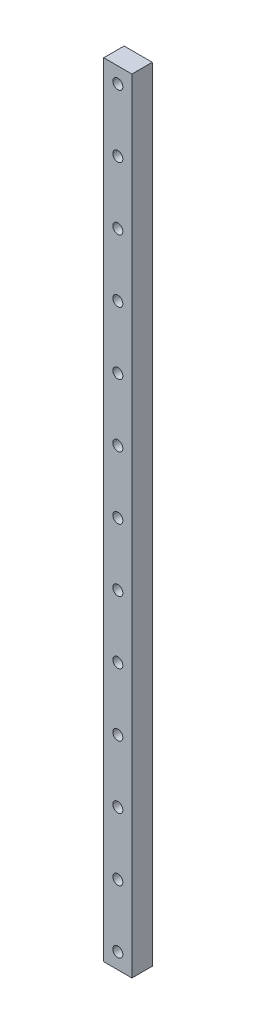
ISO-10303-21;
HEADER;
FILE_DESCRIPTION(('STEP AP214'),'2;1');
FILE_NAME('part.step','',(''),(''),'','','');
FILE_SCHEMA(('AUTOMOTIVE_DESIGN { 1 0 10303 214 1 1 1 1 }'));
ENDSEC;
DATA;
#1=APPLICATION_CONTEXT('core data for automotive mechanical design processes');
#2=APPLICATION_PROTOCOL_DEFINITION('international standard','automotive_design',2000,#1);
#3=PRODUCT_CONTEXT('',#1,'mechanical');
#4=PRODUCT('Part','Part','',(#3));
#5=PRODUCT_RELATED_PRODUCT_CATEGORY('part','',(#4));
#6=PRODUCT_DEFINITION_FORMATION('','',#4);
#7=PRODUCT_DEFINITION_CONTEXT('part definition',#1,'design');
#8=PRODUCT_DEFINITION('design','',#6,#7);
#9=PRODUCT_DEFINITION_SHAPE('','',#8);
#10=(LENGTH_UNIT() NAMED_UNIT(*) SI_UNIT(.MILLI.,.METRE.));
#11=(NAMED_UNIT(*) PLANE_ANGLE_UNIT() SI_UNIT($,.RADIAN.));
#12=(NAMED_UNIT(*) SI_UNIT($,.STERADIAN.) SOLID_ANGLE_UNIT());
#13=UNCERTAINTY_MEASURE_WITH_UNIT(LENGTH_MEASURE(1.E-05),#10,'distance_accuracy_value','');
#14=(GEOMETRIC_REPRESENTATION_CONTEXT(3) GLOBAL_UNCERTAINTY_ASSIGNED_CONTEXT((#13)) GLOBAL_UNIT_ASSIGNED_CONTEXT((#10,
#11,#12)) REPRESENTATION_CONTEXT('',''));
#15=CARTESIAN_POINT('',(0.,0.,0.));
#16=DIRECTION('',(0.,0.,1.));
#17=DIRECTION('',(1.,0.,0.));
#18=AXIS2_PLACEMENT_3D('',#15,#16,#17);
#19=CARTESIAN_POINT('',(0.,25.,-276.75));
#20=DIRECTION('',(0.,0.,1.));
#21=DIRECTION('',(1.,0.,0.));
#22=AXIS2_PLACEMENT_3D('',#19,#20,#21);
#23=CYLINDRICAL_SURFACE('',#22,1.6);
#24=DIRECTION('',(0.,0.,1.));
#25=VECTOR('',#24,1.);
#26=CARTESIAN_POINT('',(-1.6,25.,-276.75));
#27=LINE('',#26,#25);
#28=CARTESIAN_POINT('',(-1.6,25.,-3.25));
#29=VERTEX_POINT('',#28);
#30=CARTESIAN_POINT('',(-1.6,25.,3.25));
#31=VERTEX_POINT('',#30);
#32=EDGE_CURVE('E335',#29,#31,#27,.T.);
#33=ORIENTED_EDGE('',*,*,#32,.F.);
#34=CARTESIAN_POINT('',(0.,25.,-3.25));
#35=DIRECTION('',(0.,0.,1.));
#36=DIRECTION('',(1.,0.,0.));
#37=AXIS2_PLACEMENT_3D('',#34,#35,#36);
#38=CIRCLE('',#37,1.6);
#39=CARTESIAN_POINT('',(1.6,25.,-3.25));
#40=VERTEX_POINT('',#39);
#41=EDGE_CURVE('E385',#40,#29,#38,.T.);
#42=ORIENTED_EDGE('',*,*,#41,.F.);
#43=DIRECTION('',(0.,0.,1.));
#44=VECTOR('',#43,1.);
#45=CARTESIAN_POINT('',(1.6,25.,-276.75));
#46=LINE('',#45,#44);
#47=CARTESIAN_POINT('',(1.6,25.,3.25));
#48=VERTEX_POINT('',#47);
#49=EDGE_CURVE('E434',#40,#48,#46,.T.);
#50=ORIENTED_EDGE('',*,*,#49,.T.);
#51=CARTESIAN_POINT('',(0.,25.,3.25));
#52=DIRECTION('',(0.,0.,1.));
#53=DIRECTION('',(1.,0.,0.));
#54=AXIS2_PLACEMENT_3D('',#51,#52,#53);
#55=CIRCLE('',#54,1.6);
#56=EDGE_CURVE('E27',#48,#31,#55,.T.);
#57=ORIENTED_EDGE('',*,*,#56,.T.);
#58=EDGE_LOOP('',(#33,#42,#50,#57));
#59=FACE_BOUND('',#58,.T.);
#60=ADVANCED_FACE('F16',(#59),#23,.F.);
#61=CARTESIAN_POINT('',(0.,5.,-276.75));
#62=DIRECTION('',(0.,0.,1.));
#63=DIRECTION('',(1.,0.,0.));
#64=AXIS2_PLACEMENT_3D('',#61,#62,#63);
#65=CYLINDRICAL_SURFACE('',#64,1.6);
#66=DIRECTION('',(0.,0.,1.));
#67=VECTOR('',#66,1.);
#68=CARTESIAN_POINT('',(-1.6,5.,-276.75));
#69=LINE('',#68,#67);
#70=CARTESIAN_POINT('',(-1.6,5.,-3.25));
#71=VERTEX_POINT('',#70);
#72=CARTESIAN_POINT('',(-1.6,5.,3.25));
#73=VERTEX_POINT('',#72);
#74=EDGE_CURVE('E305',#71,#73,#69,.T.);
#75=ORIENTED_EDGE('',*,*,#74,.F.);
#76=CARTESIAN_POINT('',(0.,5.,-3.25));
#77=DIRECTION('',(0.,0.,1.));
#78=DIRECTION('',(1.,0.,0.));
#79=AXIS2_PLACEMENT_3D('',#76,#77,#78);
#80=CIRCLE('',#79,1.6);
#81=CARTESIAN_POINT('',(1.6,5.,-3.25));
#82=VERTEX_POINT('',#81);
#83=EDGE_CURVE('E277',#82,#71,#80,.T.);
#84=ORIENTED_EDGE('',*,*,#83,.F.);
#85=DIRECTION('',(0.,0.,1.));
#86=VECTOR('',#85,1.);
#87=CARTESIAN_POINT('',(1.6,5.,-276.75));
#88=LINE('',#87,#86);
#89=CARTESIAN_POINT('',(1.6,5.,3.25));
#90=VERTEX_POINT('',#89);
#91=EDGE_CURVE('E421',#82,#90,#88,.T.);
#92=ORIENTED_EDGE('',*,*,#91,.T.);
#93=CARTESIAN_POINT('',(0.,5.,3.25));
#94=DIRECTION('',(0.,0.,1.));
#95=DIRECTION('',(1.,0.,0.));
#96=AXIS2_PLACEMENT_3D('',#93,#94,#95);
#97=CIRCLE('',#96,1.6);
#98=EDGE_CURVE('E10',#90,#73,#97,.T.);
#99=ORIENTED_EDGE('',*,*,#98,.T.);
#100=EDGE_LOOP('',(#75,#84,#92,#99));
#101=FACE_BOUND('',#100,.T.);
#102=ADVANCED_FACE('F1002',(#101),#65,.F.);
#103=CARTESIAN_POINT('',(0.,0.,0.));
#104=DIRECTION('',(0.,-1.,0.));
#105=DIRECTION('',(0.,0.,-1.));
#106=AXIS2_PLACEMENT_3D('',#103,#104,#105);
#107=PLANE('',#106);
#108=DIRECTION('',(0.,0.,-1.));
#109=VECTOR('',#108,1.);
#110=CARTESIAN_POINT('',(4.5,0.,3.25));
#111=LINE('',#110,#109);
#112=CARTESIAN_POINT('',(4.5,0.,3.25));
#113=VERTEX_POINT('',#112);
#114=CARTESIAN_POINT('',(4.5,0.,-3.25));
#115=VERTEX_POINT('',#114);
#116=EDGE_CURVE('E263',#113,#115,#111,.T.);
#117=ORIENTED_EDGE('',*,*,#116,.F.);
#118=DIRECTION('',(1.,0.,0.));
#119=VECTOR('',#118,1.);
#120=CARTESIAN_POINT('',(-4.5,0.,3.25));
#121=LINE('',#120,#119);
#122=CARTESIAN_POINT('',(-4.5,0.,3.25));
#123=VERTEX_POINT('',#122);
#124=EDGE_CURVE('E399',#123,#113,#121,.T.);
#125=ORIENTED_EDGE('',*,*,#124,.F.);
#126=DIRECTION('',(0.,0.,1.));
#127=VECTOR('',#126,1.);
#128=CARTESIAN_POINT('',(-4.5,0.,3.25));
#129=LINE('',#128,#127);
#130=CARTESIAN_POINT('',(-4.5,0.,-3.25));
#131=VERTEX_POINT('',#130);
#132=EDGE_CURVE('E272',#131,#123,#129,.T.);
#133=ORIENTED_EDGE('',*,*,#132,.F.);
#134=DIRECTION('',(-1.,0.,0.));
#135=VECTOR('',#134,1.);
#136=CARTESIAN_POINT('',(-4.5,0.,-3.25));
#137=LINE('',#136,#135);
#138=EDGE_CURVE('E464',#115,#131,#137,.T.);
#139=ORIENTED_EDGE('',*,*,#138,.F.);
#140=EDGE_LOOP('',(#117,#125,#133,#139));
#141=FACE_BOUND('',#140,.T.);
#142=ADVANCED_FACE('F18',(#141),#107,.T.);
#143=CARTESIAN_POINT('',(0.,250.,0.));
#144=DIRECTION('',(0.,-1.,0.));
#145=DIRECTION('',(0.,0.,-1.));
#146=AXIS2_PLACEMENT_3D('',#143,#144,#145);
#147=PLANE('',#146);
#148=DIRECTION('',(0.,0.,-1.));
#149=VECTOR('',#148,1.);
#150=CARTESIAN_POINT('',(4.5,250.,3.25));
#151=LINE('',#150,#149);
#152=CARTESIAN_POINT('',(4.5,250.,3.25));
#153=VERTEX_POINT('',#152);
#154=CARTESIAN_POINT('',(4.5,250.,-3.25));
#155=VERTEX_POINT('',#154);
#156=EDGE_CURVE('E453',#153,#155,#151,.T.);
#157=ORIENTED_EDGE('',*,*,#156,.T.);
#158=DIRECTION('',(-1.,0.,0.));
#159=VECTOR('',#158,1.);
#160=CARTESIAN_POINT('',(-4.5,250.,-3.25));
#161=LINE('',#160,#159);
#162=CARTESIAN_POINT('',(-4.5,250.,-3.25));
#163=VERTEX_POINT('',#162);
#164=EDGE_CURVE('E388',#155,#163,#161,.T.);
#165=ORIENTED_EDGE('',*,*,#164,.T.);
#166=DIRECTION('',(0.,0.,1.));
#167=VECTOR('',#166,1.);
#168=CARTESIAN_POINT('',(-4.5,250.,3.25));
#169=LINE('',#168,#167);
#170=CARTESIAN_POINT('',(-4.5,250.,3.25));
#171=VERTEX_POINT('',#170);
#172=EDGE_CURVE('E495',#163,#171,#169,.T.);
#173=ORIENTED_EDGE('',*,*,#172,.T.);
#174=DIRECTION('',(1.,0.,0.));
#175=VECTOR('',#174,1.);
#176=CARTESIAN_POINT('',(-4.5,250.,3.25));
#177=LINE('',#176,#175);
#178=EDGE_CURVE('E41',#171,#153,#177,.T.);
#179=ORIENTED_EDGE('',*,*,#178,.T.);
#180=EDGE_LOOP('',(#157,#165,#173,#179));
#181=FACE_BOUND('',#180,.T.);
#182=ADVANCED_FACE('F624',(#181),#147,.F.);
#183=CARTESIAN_POINT('',(-4.5,250.,3.25));
#184=DIRECTION('',(0.,0.,-1.));
#185=DIRECTION('',(0.,-1.,0.));
#186=AXIS2_PLACEMENT_3D('',#183,#184,#185);
#187=PLANE('',#186);
#188=CARTESIAN_POINT('',(0.,245.,3.25));
#189=DIRECTION('',(0.,0.,1.));
#190=DIRECTION('',(1.,0.,0.));
#191=AXIS2_PLACEMENT_3D('',#188,#189,#190);
#192=CIRCLE('',#191,1.6);
#193=CARTESIAN_POINT('',(1.6,245.,3.25));
#194=VERTEX_POINT('',#193);
#195=CARTESIAN_POINT('',(-1.6,245.,3.25));
#196=VERTEX_POINT('',#195);
#197=EDGE_CURVE('E326',#194,#196,#192,.T.);
#198=ORIENTED_EDGE('',*,*,#197,.F.);
#199=CARTESIAN_POINT('',(0.,245.,3.25));
#200=DIRECTION('',(0.,0.,1.));
#201=DIRECTION('',(1.,0.,0.));
#202=AXIS2_PLACEMENT_3D('',#199,#200,#201);
#203=CIRCLE('',#202,1.6);
#204=EDGE_CURVE('E252',#196,#194,#203,.T.);
#205=ORIENTED_EDGE('',*,*,#204,.F.);
#206=EDGE_LOOP('',(#198,#205));
#207=FACE_BOUND('',#206,.T.);
#208=CARTESIAN_POINT('',(0.,225.,3.25));
#209=DIRECTION('',(0.,0.,1.));
#210=DIRECTION('',(1.,0.,0.));
#211=AXIS2_PLACEMENT_3D('',#208,#209,#210);
#212=CIRCLE('',#211,1.6);
#213=CARTESIAN_POINT('',(1.6,225.,3.25));
#214=VERTEX_POINT('',#213);
#215=CARTESIAN_POINT('',(-1.6,225.,3.25));
#216=VERTEX_POINT('',#215);
#217=EDGE_CURVE('E211',#214,#216,#212,.T.);
#218=ORIENTED_EDGE('',*,*,#217,.F.);
#219=CARTESIAN_POINT('',(0.,225.,3.25));
#220=DIRECTION('',(0.,0.,1.));
#221=DIRECTION('',(1.,0.,0.));
#222=AXIS2_PLACEMENT_3D('',#219,#220,#221);
#223=CIRCLE('',#222,1.6);
#224=EDGE_CURVE('E216',#216,#214,#223,.T.);
#225=ORIENTED_EDGE('',*,*,#224,.F.);
#226=EDGE_LOOP('',(#218,#225));
#227=FACE_BOUND('',#226,.T.);
#228=CARTESIAN_POINT('',(0.,205.,3.25));
#229=DIRECTION('',(0.,0.,1.));
#230=DIRECTION('',(1.,0.,0.));
#231=AXIS2_PLACEMENT_3D('',#228,#229,#230);
#232=CIRCLE('',#231,1.6);
#233=CARTESIAN_POINT('',(1.6,205.,3.25));
#234=VERTEX_POINT('',#233);
#235=CARTESIAN_POINT('',(-1.6,205.,3.25));
#236=VERTEX_POINT('',#235);
#237=EDGE_CURVE('E415',#234,#236,#232,.T.);
#238=ORIENTED_EDGE('',*,*,#237,.F.);
#239=CARTESIAN_POINT('',(0.,205.,3.25));
#240=DIRECTION('',(0.,0.,1.));
#241=DIRECTION('',(1.,0.,0.));
#242=AXIS2_PLACEMENT_3D('',#239,#240,#241);
#243=CIRCLE('',#242,1.6);
#244=EDGE_CURVE('E371',#236,#234,#243,.T.);
#245=ORIENTED_EDGE('',*,*,#244,.F.);
#246=EDGE_LOOP('',(#238,#245));
#247=FACE_BOUND('',#246,.T.);
#248=CARTESIAN_POINT('',(0.,185.,3.25));
#249=DIRECTION('',(0.,0.,1.));
#250=DIRECTION('',(1.,0.,0.));
#251=AXIS2_PLACEMENT_3D('',#248,#249,#250);
#252=CIRCLE('',#251,1.6);
#253=CARTESIAN_POINT('',(1.6,185.,3.25));
#254=VERTEX_POINT('',#253);
#255=CARTESIAN_POINT('',(-1.6,185.,3.25));
#256=VERTEX_POINT('',#255);
#257=EDGE_CURVE('E343',#254,#256,#252,.T.);
#258=ORIENTED_EDGE('',*,*,#257,.F.);
#259=CARTESIAN_POINT('',(0.,185.,3.25));
#260=DIRECTION('',(0.,0.,1.));
#261=DIRECTION('',(1.,0.,0.));
#262=AXIS2_PLACEMENT_3D('',#259,#260,#261);
#263=CIRCLE('',#262,1.6);
#264=EDGE_CURVE('E251',#256,#254,#263,.T.);
#265=ORIENTED_EDGE('',*,*,#264,.F.);
#266=EDGE_LOOP('',(#258,#265));
#267=FACE_BOUND('',#266,.T.);
#268=CARTESIAN_POINT('',(0.,165.,3.25));
#269=DIRECTION('',(0.,0.,1.));
#270=DIRECTION('',(1.,0.,0.));
#271=AXIS2_PLACEMENT_3D('',#268,#269,#270);
#272=CIRCLE('',#271,1.6);
#273=CARTESIAN_POINT('',(1.6,165.,3.25));
#274=VERTEX_POINT('',#273);
#275=CARTESIAN_POINT('',(-1.6,165.,3.25));
#276=VERTEX_POINT('',#275);
#277=EDGE_CURVE('E353',#274,#276,#272,.T.);
#278=ORIENTED_EDGE('',*,*,#277,.F.);
#279=CARTESIAN_POINT('',(0.,165.,3.25));
#280=DIRECTION('',(0.,0.,1.));
#281=DIRECTION('',(1.,0.,0.));
#282=AXIS2_PLACEMENT_3D('',#279,#280,#281);
#283=CIRCLE('',#282,1.6);
#284=EDGE_CURVE('E286',#276,#274,#283,.T.);
#285=ORIENTED_EDGE('',*,*,#284,.F.);
#286=EDGE_LOOP('',(#278,#285));
#287=FACE_BOUND('',#286,.T.);
#288=CARTESIAN_POINT('',(0.,145.,3.25));
#289=DIRECTION('',(0.,0.,1.));
#290=DIRECTION('',(1.,0.,0.));
#291=AXIS2_PLACEMENT_3D('',#288,#289,#290);
#292=CIRCLE('',#291,1.6);
#293=CARTESIAN_POINT('',(1.6,145.,3.25));
#294=VERTEX_POINT('',#293);
#295=CARTESIAN_POINT('',(-1.6,145.,3.25));
#296=VERTEX_POINT('',#295);
#297=EDGE_CURVE('E352',#294,#296,#292,.T.);
#298=ORIENTED_EDGE('',*,*,#297,.F.);
#299=CARTESIAN_POINT('',(0.,145.,3.25));
#300=DIRECTION('',(0.,0.,1.));
#301=DIRECTION('',(1.,0.,0.));
#302=AXIS2_PLACEMENT_3D('',#299,#300,#301);
#303=CIRCLE('',#302,1.6);
#304=EDGE_CURVE('E380',#296,#294,#303,.T.);
#305=ORIENTED_EDGE('',*,*,#304,.F.);
#306=EDGE_LOOP('',(#298,#305));
#307=FACE_BOUND('',#306,.T.);
#308=CARTESIAN_POINT('',(0.,125.,3.25));
#309=DIRECTION('',(0.,0.,1.));
#310=DIRECTION('',(1.,0.,0.));
#311=AXIS2_PLACEMENT_3D('',#308,#309,#310);
#312=CIRCLE('',#311,1.6);
#313=CARTESIAN_POINT('',(1.6,125.,3.25));
#314=VERTEX_POINT('',#313);
#315=CARTESIAN_POINT('',(-1.6,125.,3.25));
#316=VERTEX_POINT('',#315);
#317=EDGE_CURVE('E393',#314,#316,#312,.T.);
#318=ORIENTED_EDGE('',*,*,#317,.F.);
#319=CARTESIAN_POINT('',(0.,125.,3.25));
#320=DIRECTION('',(0.,0.,1.));
#321=DIRECTION('',(1.,0.,0.));
#322=AXIS2_PLACEMENT_3D('',#319,#320,#321);
#323=CIRCLE('',#322,1.6);
#324=EDGE_CURVE('E447',#316,#314,#323,.T.);
#325=ORIENTED_EDGE('',*,*,#324,.F.);
#326=EDGE_LOOP('',(#318,#325));
#327=FACE_BOUND('',#326,.T.);
#328=CARTESIAN_POINT('',(0.,105.,3.25));
#329=DIRECTION('',(0.,0.,1.));
#330=DIRECTION('',(1.,0.,0.));
#331=AXIS2_PLACEMENT_3D('',#328,#329,#330);
#332=CIRCLE('',#331,1.6);
#333=CARTESIAN_POINT('',(1.6,105.,3.25));
#334=VERTEX_POINT('',#333);
#335=CARTESIAN_POINT('',(-1.6,105.,3.25));
#336=VERTEX_POINT('',#335);
#337=EDGE_CURVE('E354',#334,#336,#332,.T.);
#338=ORIENTED_EDGE('',*,*,#337,.F.);
#339=CARTESIAN_POINT('',(0.,105.,3.25));
#340=DIRECTION('',(0.,0.,1.));
#341=DIRECTION('',(1.,0.,0.));
#342=AXIS2_PLACEMENT_3D('',#339,#340,#341);
#343=CIRCLE('',#342,1.6);
#344=EDGE_CURVE('E318',#336,#334,#343,.T.);
#345=ORIENTED_EDGE('',*,*,#344,.F.);
#346=EDGE_LOOP('',(#338,#345));
#347=FACE_BOUND('',#346,.T.);
#348=CARTESIAN_POINT('',(0.,85.,3.25));
#349=DIRECTION('',(0.,0.,1.));
#350=DIRECTION('',(1.,0.,0.));
#351=AXIS2_PLACEMENT_3D('',#348,#349,#350);
#352=CIRCLE('',#351,1.6);
#353=CARTESIAN_POINT('',(1.6,85.,3.25));
#354=VERTEX_POINT('',#353);
#355=CARTESIAN_POINT('',(-1.6,85.,3.25));
#356=VERTEX_POINT('',#355);
#357=EDGE_CURVE('E258',#354,#356,#352,.T.);
#358=ORIENTED_EDGE('',*,*,#357,.F.);
#359=CARTESIAN_POINT('',(0.,85.,3.25));
#360=DIRECTION('',(0.,0.,1.));
#361=DIRECTION('',(1.,0.,0.));
#362=AXIS2_PLACEMENT_3D('',#359,#360,#361);
#363=CIRCLE('',#362,1.6);
#364=EDGE_CURVE('E298',#356,#354,#363,.T.);
#365=ORIENTED_EDGE('',*,*,#364,.F.);
#366=EDGE_LOOP('',(#358,#365));
#367=FACE_BOUND('',#366,.T.);
#368=CARTESIAN_POINT('',(0.,65.,3.25));
#369=DIRECTION('',(0.,0.,1.));
#370=DIRECTION('',(1.,0.,0.));
#371=AXIS2_PLACEMENT_3D('',#368,#369,#370);
#372=CIRCLE('',#371,1.6);
#373=CARTESIAN_POINT('',(1.6,65.,3.25));
#374=VERTEX_POINT('',#373);
#375=CARTESIAN_POINT('',(-1.6,65.,3.25));
#376=VERTEX_POINT('',#375);
#377=EDGE_CURVE('E278',#374,#376,#372,.T.);
#378=ORIENTED_EDGE('',*,*,#377,.F.);
#379=CARTESIAN_POINT('',(0.,65.,3.25));
#380=DIRECTION('',(0.,0.,1.));
#381=DIRECTION('',(1.,0.,0.));
#382=AXIS2_PLACEMENT_3D('',#379,#380,#381);
#383=CIRCLE('',#382,1.6);
#384=EDGE_CURVE('E363',#376,#374,#383,.T.);
#385=ORIENTED_EDGE('',*,*,#384,.F.);
#386=EDGE_LOOP('',(#378,#385));
#387=FACE_BOUND('',#386,.T.);
#388=CARTESIAN_POINT('',(0.,45.,3.25));
#389=DIRECTION('',(0.,0.,1.));
#390=DIRECTION('',(1.,0.,0.));
#391=AXIS2_PLACEMENT_3D('',#388,#389,#390);
#392=CIRCLE('',#391,1.6);
#393=CARTESIAN_POINT('',(1.6,45.,3.25));
#394=VERTEX_POINT('',#393);
#395=CARTESIAN_POINT('',(-1.6,45.,3.25));
#396=VERTEX_POINT('',#395);
#397=EDGE_CURVE('E268',#394,#396,#392,.T.);
#398=ORIENTED_EDGE('',*,*,#397,.F.);
#399=CARTESIAN_POINT('',(0.,45.,3.25));
#400=DIRECTION('',(0.,0.,1.));
#401=DIRECTION('',(1.,0.,0.));
#402=AXIS2_PLACEMENT_3D('',#399,#400,#401);
#403=CIRCLE('',#402,1.6);
#404=EDGE_CURVE('E293',#396,#394,#403,.T.);
#405=ORIENTED_EDGE('',*,*,#404,.F.);
#406=EDGE_LOOP('',(#398,#405));
#407=FACE_BOUND('',#406,.T.);
#408=ORIENTED_EDGE('',*,*,#98,.F.);
#409=CARTESIAN_POINT('',(0.,5.,3.25));
#410=DIRECTION('',(0.,0.,1.));
#411=DIRECTION('',(1.,0.,0.));
#412=AXIS2_PLACEMENT_3D('',#409,#410,#411);
#413=CIRCLE('',#412,1.6);
#414=EDGE_CURVE('E309',#73,#90,#413,.T.);
#415=ORIENTED_EDGE('',*,*,#414,.F.);
#416=EDGE_LOOP('',(#408,#415));
#417=FACE_BOUND('',#416,.T.);
#418=ORIENTED_EDGE('',*,*,#56,.F.);
#419=CARTESIAN_POINT('',(0.,25.,3.25));
#420=DIRECTION('',(0.,0.,1.));
#421=DIRECTION('',(1.,0.,0.));
#422=AXIS2_PLACEMENT_3D('',#419,#420,#421);
#423=CIRCLE('',#422,1.6);
#424=EDGE_CURVE('E339',#31,#48,#423,.T.);
#425=ORIENTED_EDGE('',*,*,#424,.F.);
#426=EDGE_LOOP('',(#418,#425));
#427=FACE_BOUND('',#426,.T.);
#428=ORIENTED_EDGE('',*,*,#124,.T.);
#429=DIRECTION('',(0.,-1.,0.));
#430=VECTOR('',#429,1.);
#431=CARTESIAN_POINT('',(4.5,250.,3.25));
#432=LINE('',#431,#430);
#433=EDGE_CURVE('E469',#153,#113,#432,.T.);
#434=ORIENTED_EDGE('',*,*,#433,.F.);
#435=ORIENTED_EDGE('',*,*,#178,.F.);
#436=DIRECTION('',(0.,-1.,0.));
#437=VECTOR('',#436,1.);
#438=CARTESIAN_POINT('',(-4.5,250.,3.25));
#439=LINE('',#438,#437);
#440=EDGE_CURVE('E276',#171,#123,#439,.T.);
#441=ORIENTED_EDGE('',*,*,#440,.T.);
#442=EDGE_LOOP('',(#428,#434,#435,#441));
#443=FACE_BOUND('',#442,.T.);
#444=ADVANCED_FACE('F213',(#207,#227,#247,#267,#287,#307,#327,#347,#367,#387,#407,#417,#427,
#443),#187,.F.);
#445=CARTESIAN_POINT('',(-4.5,250.,3.25));
#446=DIRECTION('',(1.,0.,0.));
#447=DIRECTION('',(0.,1.,0.));
#448=AXIS2_PLACEMENT_3D('',#445,#446,#447);
#449=PLANE('',#448);
#450=ORIENTED_EDGE('',*,*,#132,.T.);
#451=ORIENTED_EDGE('',*,*,#440,.F.);
#452=ORIENTED_EDGE('',*,*,#172,.F.);
#453=DIRECTION('',(0.,-1.,0.));
#454=VECTOR('',#453,1.);
#455=CARTESIAN_POINT('',(-4.5,250.,-3.25));
#456=LINE('',#455,#454);
#457=EDGE_CURVE('E468',#163,#131,#456,.T.);
#458=ORIENTED_EDGE('',*,*,#457,.T.);
#459=EDGE_LOOP('',(#450,#451,#452,#458));
#460=FACE_BOUND('',#459,.T.);
#461=ADVANCED_FACE('F567',(#460),#449,.F.);
#462=CARTESIAN_POINT('',(-4.5,250.,-3.25));
#463=DIRECTION('',(0.,0.,1.));
#464=DIRECTION('',(1.,0.,0.));
#465=AXIS2_PLACEMENT_3D('',#462,#463,#464);
#466=PLANE('',#465);
#467=CARTESIAN_POINT('',(0.,245.,-3.25));
#468=DIRECTION('',(0.,0.,1.));
#469=DIRECTION('',(1.,0.,0.));
#470=AXIS2_PLACEMENT_3D('',#467,#468,#469);
#471=CIRCLE('',#470,1.6);
#472=CARTESIAN_POINT('',(1.6,245.,-3.25));
#473=VERTEX_POINT('',#472);
#474=CARTESIAN_POINT('',(-1.6,245.,-3.25));
#475=VERTEX_POINT('',#474);
#476=EDGE_CURVE('E329',#473,#475,#471,.T.);
#477=ORIENTED_EDGE('',*,*,#476,.T.);
#478=CARTESIAN_POINT('',(0.,245.,-3.25));
#479=DIRECTION('',(0.,0.,1.));
#480=DIRECTION('',(1.,0.,0.));
#481=AXIS2_PLACEMENT_3D('',#478,#479,#480);
#482=CIRCLE('',#481,1.6);
#483=EDGE_CURVE('E233',#475,#473,#482,.T.);
#484=ORIENTED_EDGE('',*,*,#483,.T.);
#485=EDGE_LOOP('',(#477,#484));
#486=FACE_BOUND('',#485,.T.);
#487=CARTESIAN_POINT('',(0.,225.,-3.25));
#488=DIRECTION('',(0.,0.,1.));
#489=DIRECTION('',(1.,0.,0.));
#490=AXIS2_PLACEMENT_3D('',#487,#488,#489);
#491=CIRCLE('',#490,1.6);
#492=CARTESIAN_POINT('',(1.6,225.,-3.25));
#493=VERTEX_POINT('',#492);
#494=CARTESIAN_POINT('',(-1.6,225.,-3.25));
#495=VERTEX_POINT('',#494);
#496=EDGE_CURVE('E222',#493,#495,#491,.T.);
#497=ORIENTED_EDGE('',*,*,#496,.T.);
#498=CARTESIAN_POINT('',(0.,225.,-3.25));
#499=DIRECTION('',(0.,0.,1.));
#500=DIRECTION('',(1.,0.,0.));
#501=AXIS2_PLACEMENT_3D('',#498,#499,#500);
#502=CIRCLE('',#501,1.6);
#503=EDGE_CURVE('E241',#495,#493,#502,.T.);
#504=ORIENTED_EDGE('',*,*,#503,.T.);
#505=EDGE_LOOP('',(#497,#504));
#506=FACE_BOUND('',#505,.T.);
#507=CARTESIAN_POINT('',(0.,205.,-3.25));
#508=DIRECTION('',(0.,0.,1.));
#509=DIRECTION('',(1.,0.,0.));
#510=AXIS2_PLACEMENT_3D('',#507,#508,#509);
#511=CIRCLE('',#510,1.6);
#512=CARTESIAN_POINT('',(1.6,205.,-3.25));
#513=VERTEX_POINT('',#512);
#514=CARTESIAN_POINT('',(-1.6,205.,-3.25));
#515=VERTEX_POINT('',#514);
#516=EDGE_CURVE('E221',#513,#515,#511,.T.);
#517=ORIENTED_EDGE('',*,*,#516,.T.);
#518=CARTESIAN_POINT('',(0.,205.,-3.25));
#519=DIRECTION('',(0.,0.,1.));
#520=DIRECTION('',(1.,0.,0.));
#521=AXIS2_PLACEMENT_3D('',#518,#519,#520);
#522=CIRCLE('',#521,1.6);
#523=EDGE_CURVE('E250',#515,#513,#522,.T.);
#524=ORIENTED_EDGE('',*,*,#523,.T.);
#525=EDGE_LOOP('',(#517,#524));
#526=FACE_BOUND('',#525,.T.);
#527=CARTESIAN_POINT('',(0.,185.,-3.25));
#528=DIRECTION('',(0.,0.,1.));
#529=DIRECTION('',(1.,0.,0.));
#530=AXIS2_PLACEMENT_3D('',#527,#528,#529);
#531=CIRCLE('',#530,1.6);
#532=CARTESIAN_POINT('',(1.6,185.,-3.25));
#533=VERTEX_POINT('',#532);
#534=CARTESIAN_POINT('',(-1.6,185.,-3.25));
#535=VERTEX_POINT('',#534);
#536=EDGE_CURVE('E347',#533,#535,#531,.T.);
#537=ORIENTED_EDGE('',*,*,#536,.T.);
#538=CARTESIAN_POINT('',(0.,185.,-3.25));
#539=DIRECTION('',(0.,0.,1.));
#540=DIRECTION('',(1.,0.,0.));
#541=AXIS2_PLACEMENT_3D('',#538,#539,#540);
#542=CIRCLE('',#541,1.6);
#543=EDGE_CURVE('E383',#535,#533,#542,.T.);
#544=ORIENTED_EDGE('',*,*,#543,.T.);
#545=EDGE_LOOP('',(#537,#544));
#546=FACE_BOUND('',#545,.T.);
#547=CARTESIAN_POINT('',(0.,165.,-3.25));
#548=DIRECTION('',(0.,0.,1.));
#549=DIRECTION('',(1.,0.,0.));
#550=AXIS2_PLACEMENT_3D('',#547,#548,#549);
#551=CIRCLE('',#550,1.6);
#552=CARTESIAN_POINT('',(1.6,165.,-3.25));
#553=VERTEX_POINT('',#552);
#554=CARTESIAN_POINT('',(-1.6,165.,-3.25));
#555=VERTEX_POINT('',#554);
#556=EDGE_CURVE('E100',#553,#555,#551,.T.);
#557=ORIENTED_EDGE('',*,*,#556,.T.);
#558=CARTESIAN_POINT('',(0.,165.,-3.25));
#559=DIRECTION('',(0.,0.,1.));
#560=DIRECTION('',(1.,0.,0.));
#561=AXIS2_PLACEMENT_3D('',#558,#559,#560);
#562=CIRCLE('',#561,1.6);
#563=EDGE_CURVE('E287',#555,#553,#562,.T.);
#564=ORIENTED_EDGE('',*,*,#563,.T.);
#565=EDGE_LOOP('',(#557,#564));
#566=FACE_BOUND('',#565,.T.);
#567=CARTESIAN_POINT('',(0.,145.,-3.25));
#568=DIRECTION('',(0.,0.,1.));
#569=DIRECTION('',(1.,0.,0.));
#570=AXIS2_PLACEMENT_3D('',#567,#568,#569);
#571=CIRCLE('',#570,1.6);
#572=CARTESIAN_POINT('',(1.6,145.,-3.25));
#573=VERTEX_POINT('',#572);
#574=CARTESIAN_POINT('',(-1.6,145.,-3.25));
#575=VERTEX_POINT('',#574);
#576=EDGE_CURVE('E348',#573,#575,#571,.T.);
#577=ORIENTED_EDGE('',*,*,#576,.T.);
#578=CARTESIAN_POINT('',(0.,145.,-3.25));
#579=DIRECTION('',(0.,0.,1.));
#580=DIRECTION('',(1.,0.,0.));
#581=AXIS2_PLACEMENT_3D('',#578,#579,#580);
#582=CIRCLE('',#581,1.6);
#583=EDGE_CURVE('E330',#575,#573,#582,.T.);
#584=ORIENTED_EDGE('',*,*,#583,.T.);
#585=EDGE_LOOP('',(#577,#584));
#586=FACE_BOUND('',#585,.T.);
#587=CARTESIAN_POINT('',(0.,125.,-3.25));
#588=DIRECTION('',(0.,0.,1.));
#589=DIRECTION('',(1.,0.,0.));
#590=AXIS2_PLACEMENT_3D('',#587,#588,#589);
#591=CIRCLE('',#590,1.6);
#592=CARTESIAN_POINT('',(1.6,125.,-3.25));
#593=VERTEX_POINT('',#592);
#594=CARTESIAN_POINT('',(-1.6,125.,-3.25));
#595=VERTEX_POINT('',#594);
#596=EDGE_CURVE('E396',#593,#595,#591,.T.);
#597=ORIENTED_EDGE('',*,*,#596,.T.);
#598=CARTESIAN_POINT('',(0.,125.,-3.25));
#599=DIRECTION('',(0.,0.,1.));
#600=DIRECTION('',(1.,0.,0.));
#601=AXIS2_PLACEMENT_3D('',#598,#599,#600);
#602=CIRCLE('',#601,1.6);
#603=EDGE_CURVE('E320',#595,#593,#602,.T.);
#604=ORIENTED_EDGE('',*,*,#603,.T.);
#605=EDGE_LOOP('',(#597,#604));
#606=FACE_BOUND('',#605,.T.);
#607=CARTESIAN_POINT('',(0.,105.,-3.25));
#608=DIRECTION('',(0.,0.,1.));
#609=DIRECTION('',(1.,0.,0.));
#610=AXIS2_PLACEMENT_3D('',#607,#608,#609);
#611=CIRCLE('',#610,1.6);
#612=CARTESIAN_POINT('',(1.6,105.,-3.25));
#613=VERTEX_POINT('',#612);
#614=CARTESIAN_POINT('',(-1.6,105.,-3.25));
#615=VERTEX_POINT('',#614);
#616=EDGE_CURVE('E358',#613,#615,#611,.T.);
#617=ORIENTED_EDGE('',*,*,#616,.T.);
#618=CARTESIAN_POINT('',(0.,105.,-3.25));
#619=DIRECTION('',(0.,0.,1.));
#620=DIRECTION('',(1.,0.,0.));
#621=AXIS2_PLACEMENT_3D('',#618,#619,#620);
#622=CIRCLE('',#621,1.6);
#623=EDGE_CURVE('E319',#615,#613,#622,.T.);
#624=ORIENTED_EDGE('',*,*,#623,.T.);
#625=EDGE_LOOP('',(#617,#624));
#626=FACE_BOUND('',#625,.T.);
#627=CARTESIAN_POINT('',(0.,85.,-3.25));
#628=DIRECTION('',(0.,0.,1.));
#629=DIRECTION('',(1.,0.,0.));
#630=AXIS2_PLACEMENT_3D('',#627,#628,#629);
#631=CIRCLE('',#630,1.6);
#632=CARTESIAN_POINT('',(1.6,85.,-3.25));
#633=VERTEX_POINT('',#632);
#634=CARTESIAN_POINT('',(-1.6,85.,-3.25));
#635=VERTEX_POINT('',#634);
#636=EDGE_CURVE('E262',#633,#635,#631,.T.);
#637=ORIENTED_EDGE('',*,*,#636,.T.);
#638=CARTESIAN_POINT('',(0.,85.,-3.25));
#639=DIRECTION('',(0.,0.,1.));
#640=DIRECTION('',(1.,0.,0.));
#641=AXIS2_PLACEMENT_3D('',#638,#639,#640);
#642=CIRCLE('',#641,1.6);
#643=EDGE_CURVE('E299',#635,#633,#642,.T.);
#644=ORIENTED_EDGE('',*,*,#643,.T.);
#645=EDGE_LOOP('',(#637,#644));
#646=FACE_BOUND('',#645,.T.);
#647=CARTESIAN_POINT('',(0.,65.,-3.25));
#648=DIRECTION('',(0.,0.,1.));
#649=DIRECTION('',(1.,0.,0.));
#650=AXIS2_PLACEMENT_3D('',#647,#648,#649);
#651=CIRCLE('',#650,1.6);
#652=CARTESIAN_POINT('',(1.6,65.,-3.25));
#653=VERTEX_POINT('',#652);
#654=CARTESIAN_POINT('',(-1.6,65.,-3.25));
#655=VERTEX_POINT('',#654);
#656=EDGE_CURVE('E261',#653,#655,#651,.T.);
#657=ORIENTED_EDGE('',*,*,#656,.T.);
#658=CARTESIAN_POINT('',(0.,65.,-3.25));
#659=DIRECTION('',(0.,0.,1.));
#660=DIRECTION('',(1.,0.,0.));
#661=AXIS2_PLACEMENT_3D('',#658,#659,#660);
#662=CIRCLE('',#661,1.6);
#663=EDGE_CURVE('E292',#655,#653,#662,.T.);
#664=ORIENTED_EDGE('',*,*,#663,.T.);
#665=EDGE_LOOP('',(#657,#664));
#666=FACE_BOUND('',#665,.T.);
#667=CARTESIAN_POINT('',(0.,45.,-3.25));
#668=DIRECTION('',(0.,0.,1.));
#669=DIRECTION('',(1.,0.,0.));
#670=AXIS2_PLACEMENT_3D('',#667,#668,#669);
#671=CIRCLE('',#670,1.6);
#672=CARTESIAN_POINT('',(1.6,45.,-3.25));
#673=VERTEX_POINT('',#672);
#674=CARTESIAN_POINT('',(-1.6,45.,-3.25));
#675=VERTEX_POINT('',#674);
#676=EDGE_CURVE('E271',#673,#675,#671,.T.);
#677=ORIENTED_EDGE('',*,*,#676,.T.);
#678=CARTESIAN_POINT('',(0.,45.,-3.25));
#679=DIRECTION('',(0.,0.,1.));
#680=DIRECTION('',(1.,0.,0.));
#681=AXIS2_PLACEMENT_3D('',#678,#679,#680);
#682=CIRCLE('',#681,1.6);
#683=EDGE_CURVE('E304',#675,#673,#682,.T.);
#684=ORIENTED_EDGE('',*,*,#683,.T.);
#685=EDGE_LOOP('',(#677,#684));
#686=FACE_BOUND('',#685,.T.);
#687=ORIENTED_EDGE('',*,*,#83,.T.);
#688=CARTESIAN_POINT('',(0.,5.,-3.25));
#689=DIRECTION('',(0.,0.,1.));
#690=DIRECTION('',(1.,0.,0.));
#691=AXIS2_PLACEMENT_3D('',#688,#689,#690);
#692=CIRCLE('',#691,1.6);
#693=EDGE_CURVE('E310',#71,#82,#692,.T.);
#694=ORIENTED_EDGE('',*,*,#693,.T.);
#695=EDGE_LOOP('',(#687,#694));
#696=FACE_BOUND('',#695,.T.);
#697=ORIENTED_EDGE('',*,*,#41,.T.);
#698=CARTESIAN_POINT('',(0.,25.,-3.25));
#699=DIRECTION('',(0.,0.,1.));
#700=DIRECTION('',(1.,0.,0.));
#701=AXIS2_PLACEMENT_3D('',#698,#699,#700);
#702=CIRCLE('',#701,1.6);
#703=EDGE_CURVE('E340',#29,#40,#702,.T.);
#704=ORIENTED_EDGE('',*,*,#703,.T.);
#705=EDGE_LOOP('',(#697,#704));
#706=FACE_BOUND('',#705,.T.);
#707=ORIENTED_EDGE('',*,*,#138,.T.);
#708=ORIENTED_EDGE('',*,*,#457,.F.);
#709=ORIENTED_EDGE('',*,*,#164,.F.);
#710=DIRECTION('',(0.,-1.,0.));
#711=VECTOR('',#710,1.);
#712=CARTESIAN_POINT('',(4.5,250.,-3.25));
#713=LINE('',#712,#711);
#714=EDGE_CURVE('E267',#155,#115,#713,.T.);
#715=ORIENTED_EDGE('',*,*,#714,.T.);
#716=EDGE_LOOP('',(#707,#708,#709,#715));
#717=FACE_BOUND('',#716,.T.);
#718=ADVANCED_FACE('F525',(#486,#506,#526,#546,#566,#586,#606,#626,#646,#666,#686,#696,#706,
#717),#466,.F.);
#719=CARTESIAN_POINT('',(4.5,250.,3.25));
#720=DIRECTION('',(-1.,0.,0.));
#721=DIRECTION('',(0.,0.,1.));
#722=AXIS2_PLACEMENT_3D('',#719,#720,#721);
#723=PLANE('',#722);
#724=ORIENTED_EDGE('',*,*,#116,.T.);
#725=ORIENTED_EDGE('',*,*,#714,.F.);
#726=ORIENTED_EDGE('',*,*,#156,.F.);
#727=ORIENTED_EDGE('',*,*,#433,.T.);
#728=EDGE_LOOP('',(#724,#725,#726,#727));
#729=FACE_BOUND('',#728,.T.);
#730=ADVANCED_FACE('F566',(#729),#723,.F.);
#731=CARTESIAN_POINT('',(0.,45.,-276.75));
#732=DIRECTION('',(0.,0.,1.));
#733=DIRECTION('',(1.,0.,0.));
#734=AXIS2_PLACEMENT_3D('',#731,#732,#733);
#735=CYLINDRICAL_SURFACE('',#734,1.6);
#736=DIRECTION('',(0.,0.,1.));
#737=VECTOR('',#736,1.);
#738=CARTESIAN_POINT('',(-1.6,45.,-276.75));
#739=LINE('',#738,#737);
#740=EDGE_CURVE('E300',#675,#396,#739,.T.);
#741=ORIENTED_EDGE('',*,*,#740,.F.);
#742=ORIENTED_EDGE('',*,*,#676,.F.);
#743=DIRECTION('',(0.,0.,1.));
#744=VECTOR('',#743,1.);
#745=CARTESIAN_POINT('',(1.6,45.,-276.75));
#746=LINE('',#745,#744);
#747=EDGE_CURVE('E288',#673,#394,#746,.T.);
#748=ORIENTED_EDGE('',*,*,#747,.T.);
#749=ORIENTED_EDGE('',*,*,#397,.T.);
#750=EDGE_LOOP('',(#741,#742,#748,#749));
#751=FACE_BOUND('',#750,.T.);
#752=ADVANCED_FACE('F1082',(#751),#735,.F.);
#753=CARTESIAN_POINT('',(0.,65.,-276.75));
#754=DIRECTION('',(0.,0.,1.));
#755=DIRECTION('',(1.,0.,0.));
#756=AXIS2_PLACEMENT_3D('',#753,#754,#755);
#757=CYLINDRICAL_SURFACE('',#756,1.6);
#758=DIRECTION('',(0.,0.,1.));
#759=VECTOR('',#758,1.);
#760=CARTESIAN_POINT('',(-1.6,65.,-276.75));
#761=LINE('',#760,#759);
#762=EDGE_CURVE('E389',#655,#376,#761,.T.);
#763=ORIENTED_EDGE('',*,*,#762,.F.);
#764=ORIENTED_EDGE('',*,*,#656,.F.);
#765=DIRECTION('',(0.,0.,1.));
#766=VECTOR('',#765,1.);
#767=CARTESIAN_POINT('',(1.6,65.,-276.75));
#768=LINE('',#767,#766);
#769=EDGE_CURVE('E359',#653,#374,#768,.T.);
#770=ORIENTED_EDGE('',*,*,#769,.T.);
#771=ORIENTED_EDGE('',*,*,#377,.T.);
#772=EDGE_LOOP('',(#763,#764,#770,#771));
#773=FACE_BOUND('',#772,.T.);
#774=ADVANCED_FACE('F1078',(#773),#757,.F.);
#775=CARTESIAN_POINT('',(0.,85.,-276.75));
#776=DIRECTION('',(0.,0.,1.));
#777=DIRECTION('',(1.,0.,0.));
#778=AXIS2_PLACEMENT_3D('',#775,#776,#777);
#779=CYLINDRICAL_SURFACE('',#778,1.6);
#780=DIRECTION('',(0.,0.,1.));
#781=VECTOR('',#780,1.);
#782=CARTESIAN_POINT('',(-1.6,85.,-276.75));
#783=LINE('',#782,#781);
#784=EDGE_CURVE('E294',#635,#356,#783,.T.);
#785=ORIENTED_EDGE('',*,*,#784,.F.);
#786=ORIENTED_EDGE('',*,*,#636,.F.);
#787=DIRECTION('',(0.,0.,1.));
#788=VECTOR('',#787,1.);
#789=CARTESIAN_POINT('',(1.6,85.,-276.75));
#790=LINE('',#789,#788);
#791=EDGE_CURVE('E411',#633,#354,#790,.T.);
#792=ORIENTED_EDGE('',*,*,#791,.T.);
#793=ORIENTED_EDGE('',*,*,#357,.T.);
#794=EDGE_LOOP('',(#785,#786,#792,#793));
#795=FACE_BOUND('',#794,.T.);
#796=ADVANCED_FACE('F1081',(#795),#779,.F.);
#797=CARTESIAN_POINT('',(0.,105.,-276.75));
#798=DIRECTION('',(0.,0.,1.));
#799=DIRECTION('',(1.,0.,0.));
#800=AXIS2_PLACEMENT_3D('',#797,#798,#799);
#801=CYLINDRICAL_SURFACE('',#800,1.6);
#802=DIRECTION('',(0.,0.,1.));
#803=VECTOR('',#802,1.);
#804=CARTESIAN_POINT('',(-1.6,105.,-276.75));
#805=LINE('',#804,#803);
#806=EDGE_CURVE('E314',#615,#336,#805,.T.);
#807=ORIENTED_EDGE('',*,*,#806,.F.);
#808=ORIENTED_EDGE('',*,*,#616,.F.);
#809=DIRECTION('',(0.,0.,1.));
#810=VECTOR('',#809,1.);
#811=CARTESIAN_POINT('',(1.6,105.,-276.75));
#812=LINE('',#811,#810);
#813=EDGE_CURVE('E325',#613,#334,#812,.T.);
#814=ORIENTED_EDGE('',*,*,#813,.T.);
#815=ORIENTED_EDGE('',*,*,#337,.T.);
#816=EDGE_LOOP('',(#807,#808,#814,#815));
#817=FACE_BOUND('',#816,.T.);
#818=ADVANCED_FACE('F531',(#817),#801,.F.);
#819=CARTESIAN_POINT('',(0.,125.,-276.75));
#820=DIRECTION('',(0.,0.,1.));
#821=DIRECTION('',(1.,0.,0.));
#822=AXIS2_PLACEMENT_3D('',#819,#820,#821);
#823=CYLINDRICAL_SURFACE('',#822,1.6);
#824=DIRECTION('',(0.,0.,1.));
#825=VECTOR('',#824,1.);
#826=CARTESIAN_POINT('',(-1.6,125.,-276.75));
#827=LINE('',#826,#825);
#828=EDGE_CURVE('E324',#595,#316,#827,.T.);
#829=ORIENTED_EDGE('',*,*,#828,.F.);
#830=ORIENTED_EDGE('',*,*,#596,.F.);
#831=DIRECTION('',(0.,0.,1.));
#832=VECTOR('',#831,1.);
#833=CARTESIAN_POINT('',(1.6,125.,-276.75));
#834=LINE('',#833,#832);
#835=EDGE_CURVE('E244',#593,#314,#834,.T.);
#836=ORIENTED_EDGE('',*,*,#835,.T.);
#837=ORIENTED_EDGE('',*,*,#317,.T.);
#838=EDGE_LOOP('',(#829,#830,#836,#837));
#839=FACE_BOUND('',#838,.T.);
#840=ADVANCED_FACE('F977',(#839),#823,.F.);
#841=CARTESIAN_POINT('',(0.,145.,-276.75));
#842=DIRECTION('',(0.,0.,1.));
#843=DIRECTION('',(1.,0.,0.));
#844=AXIS2_PLACEMENT_3D('',#841,#842,#843);
#845=CYLINDRICAL_SURFACE('',#844,1.6);
#846=DIRECTION('',(0.,0.,1.));
#847=VECTOR('',#846,1.);
#848=CARTESIAN_POINT('',(-1.6,145.,-276.75));
#849=LINE('',#848,#847);
#850=EDGE_CURVE('E334',#575,#296,#849,.T.);
#851=ORIENTED_EDGE('',*,*,#850,.F.);
#852=ORIENTED_EDGE('',*,*,#576,.F.);
#853=DIRECTION('',(0.,0.,1.));
#854=VECTOR('',#853,1.);
#855=CARTESIAN_POINT('',(1.6,145.,-276.75));
#856=LINE('',#855,#854);
#857=EDGE_CURVE('E457',#573,#294,#856,.T.);
#858=ORIENTED_EDGE('',*,*,#857,.T.);
#859=ORIENTED_EDGE('',*,*,#297,.T.);
#860=EDGE_LOOP('',(#851,#852,#858,#859));
#861=FACE_BOUND('',#860,.T.);
#862=ADVANCED_FACE('F1047',(#861),#845,.F.);
#863=CARTESIAN_POINT('',(0.,165.,-276.75));
#864=DIRECTION('',(0.,0.,1.));
#865=DIRECTION('',(1.,0.,0.));
#866=AXIS2_PLACEMENT_3D('',#863,#864,#865);
#867=CYLINDRICAL_SURFACE('',#866,1.6);
#868=DIRECTION('',(0.,0.,1.));
#869=VECTOR('',#868,1.);
#870=CARTESIAN_POINT('',(-1.6,165.,-276.75));
#871=LINE('',#870,#869);
#872=EDGE_CURVE('E282',#555,#276,#871,.T.);
#873=ORIENTED_EDGE('',*,*,#872,.F.);
#874=ORIENTED_EDGE('',*,*,#556,.F.);
#875=DIRECTION('',(0.,0.,1.));
#876=VECTOR('',#875,1.);
#877=CARTESIAN_POINT('',(1.6,165.,-276.75));
#878=LINE('',#877,#876);
#879=EDGE_CURVE('E425',#553,#274,#878,.T.);
#880=ORIENTED_EDGE('',*,*,#879,.T.);
#881=ORIENTED_EDGE('',*,*,#277,.T.);
#882=EDGE_LOOP('',(#873,#874,#880,#881));
#883=FACE_BOUND('',#882,.T.);
#884=ADVANCED_FACE('F1107',(#883),#867,.F.);
#885=CARTESIAN_POINT('',(0.,185.,-276.75));
#886=DIRECTION('',(0.,0.,1.));
#887=DIRECTION('',(1.,0.,0.));
#888=AXIS2_PLACEMENT_3D('',#885,#886,#887);
#889=CYLINDRICAL_SURFACE('',#888,1.6);
#890=DIRECTION('',(0.,0.,1.));
#891=VECTOR('',#890,1.);
#892=CARTESIAN_POINT('',(-1.6,185.,-276.75));
#893=LINE('',#892,#891);
#894=EDGE_CURVE('E370',#535,#256,#893,.T.);
#895=ORIENTED_EDGE('',*,*,#894,.F.);
#896=ORIENTED_EDGE('',*,*,#536,.F.);
#897=DIRECTION('',(0.,0.,1.));
#898=VECTOR('',#897,1.);
#899=CARTESIAN_POINT('',(1.6,185.,-276.75));
#900=LINE('',#899,#898);
#901=EDGE_CURVE('E246',#533,#254,#900,.T.);
#902=ORIENTED_EDGE('',*,*,#901,.T.);
#903=ORIENTED_EDGE('',*,*,#257,.T.);
#904=EDGE_LOOP('',(#895,#896,#902,#903));
#905=FACE_BOUND('',#904,.T.);
#906=ADVANCED_FACE('F1099',(#905),#889,.F.);
#907=CARTESIAN_POINT('',(0.,205.,-276.75));
#908=DIRECTION('',(0.,0.,1.));
#909=DIRECTION('',(1.,0.,0.));
#910=AXIS2_PLACEMENT_3D('',#907,#908,#909);
#911=CYLINDRICAL_SURFACE('',#910,1.6);
#912=DIRECTION('',(0.,0.,1.));
#913=VECTOR('',#912,1.);
#914=CARTESIAN_POINT('',(-1.6,205.,-276.75));
#915=LINE('',#914,#913);
#916=EDGE_CURVE('E376',#515,#236,#915,.T.);
#917=ORIENTED_EDGE('',*,*,#916,.F.);
#918=ORIENTED_EDGE('',*,*,#516,.F.);
#919=DIRECTION('',(0.,0.,1.));
#920=VECTOR('',#919,1.);
#921=CARTESIAN_POINT('',(1.6,205.,-276.75));
#922=LINE('',#921,#920);
#923=EDGE_CURVE('E375',#513,#234,#922,.T.);
#924=ORIENTED_EDGE('',*,*,#923,.T.);
#925=ORIENTED_EDGE('',*,*,#237,.T.);
#926=EDGE_LOOP('',(#917,#918,#924,#925));
#927=FACE_BOUND('',#926,.T.);
#928=ADVANCED_FACE('F1035',(#927),#911,.F.);
#929=CARTESIAN_POINT('',(0.,225.,-276.75));
#930=DIRECTION('',(0.,0.,1.));
#931=DIRECTION('',(1.,0.,0.));
#932=AXIS2_PLACEMENT_3D('',#929,#930,#931);
#933=CYLINDRICAL_SURFACE('',#932,1.6);
#934=DIRECTION('',(0.,0.,1.));
#935=VECTOR('',#934,1.);
#936=CARTESIAN_POINT('',(-1.6,225.,-276.75));
#937=LINE('',#936,#935);
#938=EDGE_CURVE('E20',#495,#216,#937,.T.);
#939=ORIENTED_EDGE('',*,*,#938,.F.);
#940=ORIENTED_EDGE('',*,*,#496,.F.);
#941=DIRECTION('',(0.,0.,1.));
#942=VECTOR('',#941,1.);
#943=CARTESIAN_POINT('',(1.6,225.,-276.75));
#944=LINE('',#943,#942);
#945=EDGE_CURVE('E226',#493,#214,#944,.T.);
#946=ORIENTED_EDGE('',*,*,#945,.T.);
#947=ORIENTED_EDGE('',*,*,#217,.T.);
#948=EDGE_LOOP('',(#939,#940,#946,#947));
#949=FACE_BOUND('',#948,.T.);
#950=ADVANCED_FACE('F227',(#949),#933,.F.);
#951=CARTESIAN_POINT('',(0.,245.,-276.75));
#952=DIRECTION('',(0.,0.,1.));
#953=DIRECTION('',(1.,0.,0.));
#954=AXIS2_PLACEMENT_3D('',#951,#952,#953);
#955=CYLINDRICAL_SURFACE('',#954,1.6);
#956=DIRECTION('',(0.,0.,1.));
#957=VECTOR('',#956,1.);
#958=CARTESIAN_POINT('',(-1.6,245.,-276.75));
#959=LINE('',#958,#957);
#960=EDGE_CURVE('E257',#475,#196,#959,.T.);
#961=ORIENTED_EDGE('',*,*,#960,.F.);
#962=ORIENTED_EDGE('',*,*,#476,.F.);
#963=DIRECTION('',(0.,0.,1.));
#964=VECTOR('',#963,1.);
#965=CARTESIAN_POINT('',(1.6,245.,-276.75));
#966=LINE('',#965,#964);
#967=EDGE_CURVE('E256',#473,#194,#966,.T.);
#968=ORIENTED_EDGE('',*,*,#967,.T.);
#969=ORIENTED_EDGE('',*,*,#197,.T.);
#970=EDGE_LOOP('',(#961,#962,#968,#969));
#971=FACE_BOUND('',#970,.T.);
#972=ADVANCED_FACE('F1084',(#971),#955,.F.);
#973=CARTESIAN_POINT('',(0.,245.,-276.75));
#974=DIRECTION('',(0.,0.,1.));
#975=DIRECTION('',(1.,0.,0.));
#976=AXIS2_PLACEMENT_3D('',#973,#974,#975);
#977=CYLINDRICAL_SURFACE('',#976,1.6);
#978=ORIENTED_EDGE('',*,*,#483,.F.);
#979=ORIENTED_EDGE('',*,*,#960,.T.);
#980=ORIENTED_EDGE('',*,*,#204,.T.);
#981=ORIENTED_EDGE('',*,*,#967,.F.);
#982=EDGE_LOOP('',(#978,#979,#980,#981));
#983=FACE_BOUND('',#982,.T.);
#984=ADVANCED_FACE('F1087',(#983),#977,.F.);
#985=CARTESIAN_POINT('',(0.,225.,-276.75));
#986=DIRECTION('',(0.,0.,1.));
#987=DIRECTION('',(1.,0.,0.));
#988=AXIS2_PLACEMENT_3D('',#985,#986,#987);
#989=CYLINDRICAL_SURFACE('',#988,1.6);
#990=ORIENTED_EDGE('',*,*,#503,.F.);
#991=ORIENTED_EDGE('',*,*,#938,.T.);
#992=ORIENTED_EDGE('',*,*,#224,.T.);
#993=ORIENTED_EDGE('',*,*,#945,.F.);
#994=EDGE_LOOP('',(#990,#991,#992,#993));
#995=FACE_BOUND('',#994,.T.);
#996=ADVANCED_FACE('F235',(#995),#989,.F.);
#997=CARTESIAN_POINT('',(0.,205.,-276.75));
#998=DIRECTION('',(0.,0.,1.));
#999=DIRECTION('',(1.,0.,0.));
#1000=AXIS2_PLACEMENT_3D('',#997,#998,#999);
#1001=CYLINDRICAL_SURFACE('',#1000,1.6);
#1002=ORIENTED_EDGE('',*,*,#523,.F.);
#1003=ORIENTED_EDGE('',*,*,#916,.T.);
#1004=ORIENTED_EDGE('',*,*,#244,.T.);
#1005=ORIENTED_EDGE('',*,*,#923,.F.);
#1006=EDGE_LOOP('',(#1002,#1003,#1004,#1005));
#1007=FACE_BOUND('',#1006,.T.);
#1008=ADVANCED_FACE('F1037',(#1007),#1001,.F.);
#1009=CARTESIAN_POINT('',(0.,185.,-276.75));
#1010=DIRECTION('',(0.,0.,1.));
#1011=DIRECTION('',(1.,0.,0.));
#1012=AXIS2_PLACEMENT_3D('',#1009,#1010,#1011);
#1013=CYLINDRICAL_SURFACE('',#1012,1.6);
#1014=ORIENTED_EDGE('',*,*,#543,.F.);
#1015=ORIENTED_EDGE('',*,*,#894,.T.);
#1016=ORIENTED_EDGE('',*,*,#264,.T.);
#1017=ORIENTED_EDGE('',*,*,#901,.F.);
#1018=EDGE_LOOP('',(#1014,#1015,#1016,#1017));
#1019=FACE_BOUND('',#1018,.T.);
#1020=ADVANCED_FACE('F1062',(#1019),#1013,.F.);
#1021=CARTESIAN_POINT('',(0.,165.,-276.75));
#1022=DIRECTION('',(0.,0.,1.));
#1023=DIRECTION('',(1.,0.,0.));
#1024=AXIS2_PLACEMENT_3D('',#1021,#1022,#1023);
#1025=CYLINDRICAL_SURFACE('',#1024,1.6);
#1026=ORIENTED_EDGE('',*,*,#563,.F.);
#1027=ORIENTED_EDGE('',*,*,#872,.T.);
#1028=ORIENTED_EDGE('',*,*,#284,.T.);
#1029=ORIENTED_EDGE('',*,*,#879,.F.);
#1030=EDGE_LOOP('',(#1026,#1027,#1028,#1029));
#1031=FACE_BOUND('',#1030,.T.);
#1032=ADVANCED_FACE('F1054',(#1031),#1025,.F.);
#1033=CARTESIAN_POINT('',(0.,145.,-276.75));
#1034=DIRECTION('',(0.,0.,1.));
#1035=DIRECTION('',(1.,0.,0.));
#1036=AXIS2_PLACEMENT_3D('',#1033,#1034,#1035);
#1037=CYLINDRICAL_SURFACE('',#1036,1.6);
#1038=ORIENTED_EDGE('',*,*,#583,.F.);
#1039=ORIENTED_EDGE('',*,*,#850,.T.);
#1040=ORIENTED_EDGE('',*,*,#304,.T.);
#1041=ORIENTED_EDGE('',*,*,#857,.F.);
#1042=EDGE_LOOP('',(#1038,#1039,#1040,#1041));
#1043=FACE_BOUND('',#1042,.T.);
#1044=ADVANCED_FACE('F1050',(#1043),#1037,.F.);
#1045=CARTESIAN_POINT('',(0.,125.,-276.75));
#1046=DIRECTION('',(0.,0.,1.));
#1047=DIRECTION('',(1.,0.,0.));
#1048=AXIS2_PLACEMENT_3D('',#1045,#1046,#1047);
#1049=CYLINDRICAL_SURFACE('',#1048,1.6);
#1050=ORIENTED_EDGE('',*,*,#603,.F.);
#1051=ORIENTED_EDGE('',*,*,#828,.T.);
#1052=ORIENTED_EDGE('',*,*,#324,.T.);
#1053=ORIENTED_EDGE('',*,*,#835,.F.);
#1054=EDGE_LOOP('',(#1050,#1051,#1052,#1053));
#1055=FACE_BOUND('',#1054,.T.);
#1056=ADVANCED_FACE('F981',(#1055),#1049,.F.);
#1057=CARTESIAN_POINT('',(0.,105.,-276.75));
#1058=DIRECTION('',(0.,0.,1.));
#1059=DIRECTION('',(1.,0.,0.));
#1060=AXIS2_PLACEMENT_3D('',#1057,#1058,#1059);
#1061=CYLINDRICAL_SURFACE('',#1060,1.6);
#1062=ORIENTED_EDGE('',*,*,#623,.F.);
#1063=ORIENTED_EDGE('',*,*,#806,.T.);
#1064=ORIENTED_EDGE('',*,*,#344,.T.);
#1065=ORIENTED_EDGE('',*,*,#813,.F.);
#1066=EDGE_LOOP('',(#1062,#1063,#1064,#1065));
#1067=FACE_BOUND('',#1066,.T.);
#1068=ADVANCED_FACE('F534',(#1067),#1061,.F.);
#1069=CARTESIAN_POINT('',(0.,85.,-276.75));
#1070=DIRECTION('',(0.,0.,1.));
#1071=DIRECTION('',(1.,0.,0.));
#1072=AXIS2_PLACEMENT_3D('',#1069,#1070,#1071);
#1073=CYLINDRICAL_SURFACE('',#1072,1.6);
#1074=ORIENTED_EDGE('',*,*,#643,.F.);
#1075=ORIENTED_EDGE('',*,*,#784,.T.);
#1076=ORIENTED_EDGE('',*,*,#364,.T.);
#1077=ORIENTED_EDGE('',*,*,#791,.F.);
#1078=EDGE_LOOP('',(#1074,#1075,#1076,#1077));
#1079=FACE_BOUND('',#1078,.T.);
#1080=ADVANCED_FACE('F1075',(#1079),#1073,.F.);
#1081=CARTESIAN_POINT('',(0.,65.,-276.75));
#1082=DIRECTION('',(0.,0.,1.));
#1083=DIRECTION('',(1.,0.,0.));
#1084=AXIS2_PLACEMENT_3D('',#1081,#1082,#1083);
#1085=CYLINDRICAL_SURFACE('',#1084,1.6);
#1086=ORIENTED_EDGE('',*,*,#663,.F.);
#1087=ORIENTED_EDGE('',*,*,#762,.T.);
#1088=ORIENTED_EDGE('',*,*,#384,.T.);
#1089=ORIENTED_EDGE('',*,*,#769,.F.);
#1090=EDGE_LOOP('',(#1086,#1087,#1088,#1089));
#1091=FACE_BOUND('',#1090,.T.);
#1092=ADVANCED_FACE('F1122',(#1091),#1085,.F.);
#1093=CARTESIAN_POINT('',(0.,45.,-276.75));
#1094=DIRECTION('',(0.,0.,1.));
#1095=DIRECTION('',(1.,0.,0.));
#1096=AXIS2_PLACEMENT_3D('',#1093,#1094,#1095);
#1097=CYLINDRICAL_SURFACE('',#1096,1.6);
#1098=ORIENTED_EDGE('',*,*,#683,.F.);
#1099=ORIENTED_EDGE('',*,*,#740,.T.);
#1100=ORIENTED_EDGE('',*,*,#404,.T.);
#1101=ORIENTED_EDGE('',*,*,#747,.F.);
#1102=EDGE_LOOP('',(#1098,#1099,#1100,#1101));
#1103=FACE_BOUND('',#1102,.T.);
#1104=ADVANCED_FACE('F1106',(#1103),#1097,.F.);
#1105=CARTESIAN_POINT('',(0.,5.,-276.75));
#1106=DIRECTION('',(0.,0.,1.));
#1107=DIRECTION('',(1.,0.,0.));
#1108=AXIS2_PLACEMENT_3D('',#1105,#1106,#1107);
#1109=CYLINDRICAL_SURFACE('',#1108,1.6);
#1110=ORIENTED_EDGE('',*,*,#693,.F.);
#1111=ORIENTED_EDGE('',*,*,#74,.T.);
#1112=ORIENTED_EDGE('',*,*,#414,.T.);
#1113=ORIENTED_EDGE('',*,*,#91,.F.);
#1114=EDGE_LOOP('',(#1110,#1111,#1112,#1113));
#1115=FACE_BOUND('',#1114,.T.);
#1116=ADVANCED_FACE('F1005',(#1115),#1109,.F.);
#1117=CARTESIAN_POINT('',(0.,25.,-276.75));
#1118=DIRECTION('',(0.,0.,1.));
#1119=DIRECTION('',(1.,0.,0.));
#1120=AXIS2_PLACEMENT_3D('',#1117,#1118,#1119);
#1121=CYLINDRICAL_SURFACE('',#1120,1.6);
#1122=ORIENTED_EDGE('',*,*,#703,.F.);
#1123=ORIENTED_EDGE('',*,*,#32,.T.);
#1124=ORIENTED_EDGE('',*,*,#424,.T.);
#1125=ORIENTED_EDGE('',*,*,#49,.F.);
#1126=EDGE_LOOP('',(#1122,#1123,#1124,#1125));
#1127=FACE_BOUND('',#1126,.T.);
#1128=ADVANCED_FACE('F550',(#1127),#1121,.F.);
#1129=CLOSED_SHELL('',(#60,#102,#142,#182,#444,#461,#718,#730,#752,#774,#796,#818,#840,#862,
#884,#906,#928,#950,#972,#984,#996,#1008,#1020,#1032,#1044,#1056,#1068,#1080,#1092,#1104,#1116,#1128));
#1130=MANIFOLD_SOLID_BREP('B1',#1129);
#1131=ADVANCED_BREP_SHAPE_REPRESENTATION('',(#18,#1130),#14);
#1132=SHAPE_DEFINITION_REPRESENTATION(#9,#1131);
ENDSEC;
END-ISO-10303-21;
